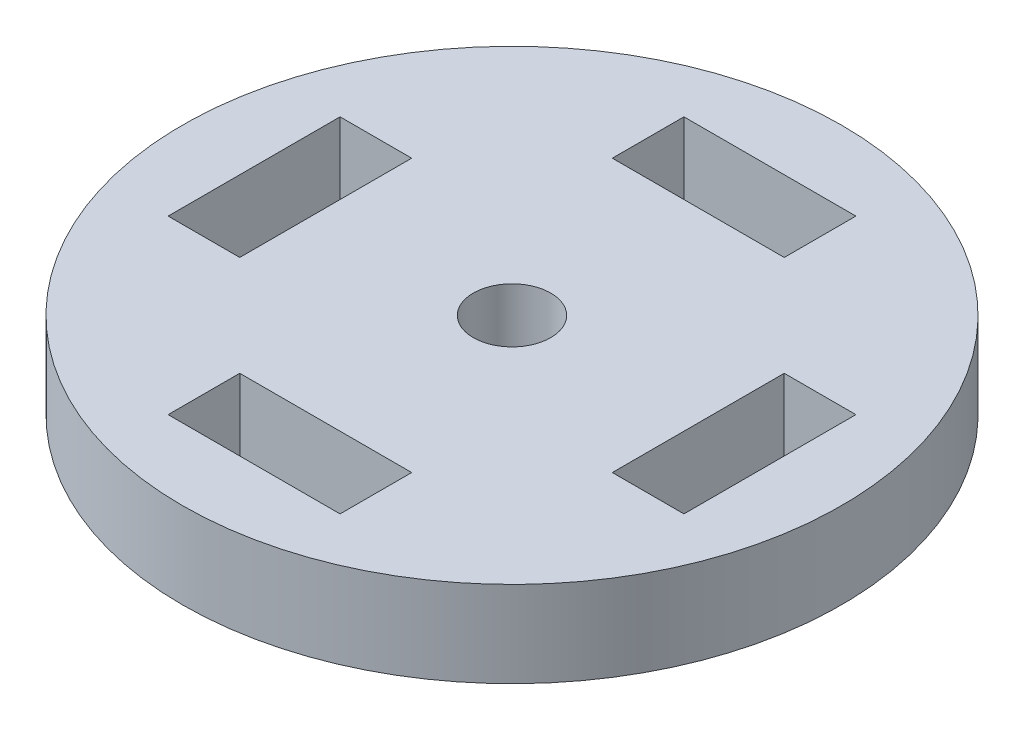
ISO-10303-21;
HEADER;
FILE_DESCRIPTION(('STEP AP214'),'2;1');
FILE_NAME('part.step','',(''),(''),'','','');
FILE_SCHEMA(('AUTOMOTIVE_DESIGN { 1 0 10303 214 1 1 1 1 }'));
ENDSEC;
DATA;
#1=APPLICATION_CONTEXT('core data for automotive mechanical design processes');
#2=APPLICATION_PROTOCOL_DEFINITION('international standard','automotive_design',2000,#1);
#3=PRODUCT_CONTEXT('',#1,'mechanical');
#4=PRODUCT('Part','Part','',(#3));
#5=PRODUCT_RELATED_PRODUCT_CATEGORY('part','',(#4));
#6=PRODUCT_DEFINITION_FORMATION('','',#4);
#7=PRODUCT_DEFINITION_CONTEXT('part definition',#1,'design');
#8=PRODUCT_DEFINITION('design','',#6,#7);
#9=PRODUCT_DEFINITION_SHAPE('','',#8);
#10=(LENGTH_UNIT() NAMED_UNIT(*) SI_UNIT(.MILLI.,.METRE.));
#11=(NAMED_UNIT(*) PLANE_ANGLE_UNIT() SI_UNIT($,.RADIAN.));
#12=(NAMED_UNIT(*) SI_UNIT($,.STERADIAN.) SOLID_ANGLE_UNIT());
#13=UNCERTAINTY_MEASURE_WITH_UNIT(LENGTH_MEASURE(1.E-05),#10,'distance_accuracy_value','');
#14=(GEOMETRIC_REPRESENTATION_CONTEXT(3) GLOBAL_UNCERTAINTY_ASSIGNED_CONTEXT((#13)) GLOBAL_UNIT_ASSIGNED_CONTEXT((#10,
#11,#12)) REPRESENTATION_CONTEXT('',''));
#15=CARTESIAN_POINT('',(0.,0.,0.));
#16=DIRECTION('',(0.,0.,1.));
#17=DIRECTION('',(1.,0.,0.));
#18=AXIS2_PLACEMENT_3D('',#15,#16,#17);
#19=CARTESIAN_POINT('',(0.,3.,0.));
#20=DIRECTION('',(0.,1.,0.));
#21=DIRECTION('',(0.,0.,1.));
#22=AXIS2_PLACEMENT_3D('',#19,#20,#21);
#23=PLANE('',#22);
#24=CARTESIAN_POINT('',(0.,3.,0.));
#25=DIRECTION('',(0.,1.,0.));
#26=DIRECTION('',(0.,0.,1.));
#27=AXIS2_PLACEMENT_3D('',#24,#25,#26);
#28=CIRCLE('',#27,1.35);
#29=CARTESIAN_POINT('',(0.,3.,1.35));
#30=VERTEX_POINT('',#29);
#31=EDGE_CURVE('E342',#30,#30,#28,.T.);
#32=ORIENTED_EDGE('',*,*,#31,.F.);
#33=EDGE_LOOP('',(#32));
#34=FACE_BOUND('',#33,.T.);
#35=CARTESIAN_POINT('',(0.,3.,0.));
#36=DIRECTION('',(0.,1.,0.));
#37=DIRECTION('',(0.,0.,1.));
#38=AXIS2_PLACEMENT_3D('',#35,#36,#37);
#39=CIRCLE('',#38,11.5);
#40=CARTESIAN_POINT('',(0.,3.,11.5));
#41=VERTEX_POINT('',#40);
#42=EDGE_CURVE('E13',#41,#41,#39,.T.);
#43=ORIENTED_EDGE('',*,*,#42,.T.);
#44=EDGE_LOOP('',(#43));
#45=FACE_BOUND('',#44,.T.);
#46=DIRECTION('',(1.,0.,0.));
#47=VECTOR('',#46,1.);
#48=CARTESIAN_POINT('',(-8.99999999999915,3.,3.00000000000172));
#49=LINE('',#48,#47);
#50=CARTESIAN_POINT('',(-8.99999999999915,3.,3.00000000000172));
#51=VERTEX_POINT('',#50);
#52=CARTESIAN_POINT('',(-6.49999999999915,3.,3.00000000000172));
#53=VERTEX_POINT('',#52);
#54=EDGE_CURVE('E318',#51,#53,#49,.T.);
#55=ORIENTED_EDGE('',*,*,#54,.F.);
#56=DIRECTION('',(0.,0.,1.));
#57=VECTOR('',#56,1.);
#58=CARTESIAN_POINT('',(-8.99999999999915,3.,-2.99999999999828));
#59=LINE('',#58,#57);
#60=CARTESIAN_POINT('',(-8.99999999999915,3.,-2.99999999999828));
#61=VERTEX_POINT('',#60);
#62=EDGE_CURVE('E322',#61,#51,#59,.T.);
#63=ORIENTED_EDGE('',*,*,#62,.F.);
#64=DIRECTION('',(-1.,0.,0.));
#65=VECTOR('',#64,1.);
#66=CARTESIAN_POINT('',(-8.99999999999915,3.,-2.99999999999828));
#67=LINE('',#66,#65);
#68=CARTESIAN_POINT('',(-6.49999999999915,3.,-2.99999999999828));
#69=VERTEX_POINT('',#68);
#70=EDGE_CURVE('E299',#69,#61,#67,.T.);
#71=ORIENTED_EDGE('',*,*,#70,.F.);
#72=DIRECTION('',(0.,0.,-1.));
#73=VECTOR('',#72,1.);
#74=CARTESIAN_POINT('',(-6.49999999999915,3.,3.00000000000172));
#75=LINE('',#74,#73);
#76=EDGE_CURVE('E294',#53,#69,#75,.T.);
#77=ORIENTED_EDGE('',*,*,#76,.F.);
#78=EDGE_LOOP('',(#55,#63,#71,#77));
#79=FACE_BOUND('',#78,.T.);
#80=DIRECTION('',(0.,0.,-1.));
#81=VECTOR('',#80,1.);
#82=CARTESIAN_POINT('',(3.00000000000256,3.,9.00000000000087));
#83=LINE('',#82,#81);
#84=CARTESIAN_POINT('',(3.00000000000256,3.,9.00000000000087));
#85=VERTEX_POINT('',#84);
#86=CARTESIAN_POINT('',(3.00000000000256,3.,6.50000000000087));
#87=VERTEX_POINT('',#86);
#88=EDGE_CURVE('E274',#85,#87,#83,.T.);
#89=ORIENTED_EDGE('',*,*,#88,.F.);
#90=DIRECTION('',(1.,0.,0.));
#91=VECTOR('',#90,1.);
#92=CARTESIAN_POINT('',(-2.99999999999744,3.,9.00000000000087));
#93=LINE('',#92,#91);
#94=CARTESIAN_POINT('',(-2.99999999999744,3.,9.00000000000087));
#95=VERTEX_POINT('',#94);
#96=EDGE_CURVE('E278',#95,#85,#93,.T.);
#97=ORIENTED_EDGE('',*,*,#96,.F.);
#98=DIRECTION('',(0.,0.,1.));
#99=VECTOR('',#98,1.);
#100=CARTESIAN_POINT('',(-2.99999999999744,3.,9.00000000000087));
#101=LINE('',#100,#99);
#102=CARTESIAN_POINT('',(-2.99999999999744,3.,6.50000000000087));
#103=VERTEX_POINT('',#102);
#104=EDGE_CURVE('E255',#103,#95,#101,.T.);
#105=ORIENTED_EDGE('',*,*,#104,.F.);
#106=DIRECTION('',(-1.,0.,0.));
#107=VECTOR('',#106,1.);
#108=CARTESIAN_POINT('',(3.00000000000256,3.,6.50000000000087));
#109=LINE('',#108,#107);
#110=EDGE_CURVE('E250',#87,#103,#109,.T.);
#111=ORIENTED_EDGE('',*,*,#110,.F.);
#112=EDGE_LOOP('',(#89,#97,#105,#111));
#113=FACE_BOUND('',#112,.T.);
#114=DIRECTION('',(-1.,0.,0.));
#115=VECTOR('',#114,1.);
#116=CARTESIAN_POINT('',(9.00000000000171,3.,-3.00000000000085));
#117=LINE('',#116,#115);
#118=CARTESIAN_POINT('',(9.00000000000171,3.,-3.00000000000085));
#119=VERTEX_POINT('',#118);
#120=CARTESIAN_POINT('',(6.50000000000171,3.,-3.00000000000084));
#121=VERTEX_POINT('',#120);
#122=EDGE_CURVE('E230',#119,#121,#117,.T.);
#123=ORIENTED_EDGE('',*,*,#122,.F.);
#124=DIRECTION('',(0.,0.,-1.));
#125=VECTOR('',#124,1.);
#126=CARTESIAN_POINT('',(9.00000000000171,3.,2.99999999999915));
#127=LINE('',#126,#125);
#128=CARTESIAN_POINT('',(9.00000000000171,3.,2.99999999999915));
#129=VERTEX_POINT('',#128);
#130=EDGE_CURVE('E234',#129,#119,#127,.T.);
#131=ORIENTED_EDGE('',*,*,#130,.F.);
#132=DIRECTION('',(1.,0.,0.));
#133=VECTOR('',#132,1.);
#134=CARTESIAN_POINT('',(9.00000000000171,3.,2.99999999999915));
#135=LINE('',#134,#133);
#136=CARTESIAN_POINT('',(6.50000000000171,3.,2.99999999999915));
#137=VERTEX_POINT('',#136);
#138=EDGE_CURVE('E211',#137,#129,#135,.T.);
#139=ORIENTED_EDGE('',*,*,#138,.F.);
#140=DIRECTION('',(0.,0.,1.));
#141=VECTOR('',#140,1.);
#142=CARTESIAN_POINT('',(6.50000000000171,3.,-3.00000000000084));
#143=LINE('',#142,#141);
#144=EDGE_CURVE('E76',#121,#137,#143,.T.);
#145=ORIENTED_EDGE('',*,*,#144,.F.);
#146=EDGE_LOOP('',(#123,#131,#139,#145));
#147=FACE_BOUND('',#146,.T.);
#148=DIRECTION('',(-1.,0.,0.));
#149=VECTOR('',#148,1.);
#150=CARTESIAN_POINT('',(3.,3.,-9.));
#151=LINE('',#150,#149);
#152=CARTESIAN_POINT('',(3.,3.,-9.));
#153=VERTEX_POINT('',#152);
#154=CARTESIAN_POINT('',(-3.,3.,-9.));
#155=VERTEX_POINT('',#154);
#156=EDGE_CURVE('E170',#153,#155,#151,.T.);
#157=ORIENTED_EDGE('',*,*,#156,.F.);
#158=DIRECTION('',(0.,0.,-1.));
#159=VECTOR('',#158,1.);
#160=CARTESIAN_POINT('',(3.,3.,-9.));
#161=LINE('',#160,#159);
#162=CARTESIAN_POINT('',(3.,3.,-6.5));
#163=VERTEX_POINT('',#162);
#164=EDGE_CURVE('E179',#163,#153,#161,.T.);
#165=ORIENTED_EDGE('',*,*,#164,.F.);
#166=DIRECTION('',(1.,0.,0.));
#167=VECTOR('',#166,1.);
#168=CARTESIAN_POINT('',(-3.,3.,-6.5));
#169=LINE('',#168,#167);
#170=CARTESIAN_POINT('',(-3.,3.,-6.5));
#171=VERTEX_POINT('',#170);
#172=EDGE_CURVE('E187',#171,#163,#169,.T.);
#173=ORIENTED_EDGE('',*,*,#172,.F.);
#174=DIRECTION('',(0.,0.,1.));
#175=VECTOR('',#174,1.);
#176=CARTESIAN_POINT('',(-3.,3.,-9.));
#177=LINE('',#176,#175);
#178=EDGE_CURVE('E68',#155,#171,#177,.T.);
#179=ORIENTED_EDGE('',*,*,#178,.F.);
#180=EDGE_LOOP('',(#157,#165,#173,#179));
#181=FACE_BOUND('',#180,.T.);
#182=ADVANCED_FACE('F52',(#34,#45,#79,#113,#147,#181),#23,.T.);
#183=CARTESIAN_POINT('',(0.,0.,0.));
#184=DIRECTION('',(0.,1.,0.));
#185=DIRECTION('',(0.,0.,1.));
#186=AXIS2_PLACEMENT_3D('',#183,#184,#185);
#187=PLANE('',#186);
#188=CARTESIAN_POINT('',(0.,0.,0.));
#189=DIRECTION('',(0.,1.,0.));
#190=DIRECTION('',(0.,0.,1.));
#191=AXIS2_PLACEMENT_3D('',#188,#189,#190);
#192=CIRCLE('',#191,1.35);
#193=CARTESIAN_POINT('',(0.,0.,1.35));
#194=VERTEX_POINT('',#193);
#195=EDGE_CURVE('E337',#194,#194,#192,.F.);
#196=ORIENTED_EDGE('',*,*,#195,.F.);
#197=EDGE_LOOP('',(#196));
#198=FACE_BOUND('',#197,.T.);
#199=DIRECTION('',(0.,0.,-1.));
#200=VECTOR('',#199,1.);
#201=CARTESIAN_POINT('',(9.00000000000171,0.,2.99999999999915));
#202=LINE('',#201,#200);
#203=CARTESIAN_POINT('',(9.00000000000171,0.,2.99999999999915));
#204=VERTEX_POINT('',#203);
#205=CARTESIAN_POINT('',(9.00000000000171,0.,-3.00000000000085));
#206=VERTEX_POINT('',#205);
#207=EDGE_CURVE('E223',#204,#206,#202,.T.);
#208=ORIENTED_EDGE('',*,*,#207,.T.);
#209=DIRECTION('',(-1.,0.,0.));
#210=VECTOR('',#209,1.);
#211=CARTESIAN_POINT('',(9.00000000000171,0.,-3.00000000000085));
#212=LINE('',#211,#210);
#213=CARTESIAN_POINT('',(6.50000000000171,0.,-3.00000000000084));
#214=VERTEX_POINT('',#213);
#215=EDGE_CURVE('E218',#206,#214,#212,.T.);
#216=ORIENTED_EDGE('',*,*,#215,.T.);
#217=DIRECTION('',(0.,0.,1.));
#218=VECTOR('',#217,1.);
#219=CARTESIAN_POINT('',(6.50000000000171,0.,-3.00000000000084));
#220=LINE('',#219,#218);
#221=CARTESIAN_POINT('',(6.50000000000171,0.,2.99999999999915));
#222=VERTEX_POINT('',#221);
#223=EDGE_CURVE('E213',#214,#222,#220,.T.);
#224=ORIENTED_EDGE('',*,*,#223,.T.);
#225=DIRECTION('',(1.,0.,0.));
#226=VECTOR('',#225,1.);
#227=CARTESIAN_POINT('',(9.00000000000171,0.,2.99999999999915));
#228=LINE('',#227,#226);
#229=EDGE_CURVE('E207',#222,#204,#228,.T.);
#230=ORIENTED_EDGE('',*,*,#229,.T.);
#231=EDGE_LOOP('',(#208,#216,#224,#230));
#232=FACE_BOUND('',#231,.T.);
#233=DIRECTION('',(0.,0.,1.));
#234=VECTOR('',#233,1.);
#235=CARTESIAN_POINT('',(-8.99999999999915,0.,-2.99999999999828));
#236=LINE('',#235,#234);
#237=CARTESIAN_POINT('',(-8.99999999999915,0.,-2.99999999999828));
#238=VERTEX_POINT('',#237);
#239=CARTESIAN_POINT('',(-8.99999999999915,0.,3.00000000000172));
#240=VERTEX_POINT('',#239);
#241=EDGE_CURVE('E311',#238,#240,#236,.T.);
#242=ORIENTED_EDGE('',*,*,#241,.T.);
#243=DIRECTION('',(1.,0.,0.));
#244=VECTOR('',#243,1.);
#245=CARTESIAN_POINT('',(-8.99999999999915,0.,3.00000000000172));
#246=LINE('',#245,#244);
#247=CARTESIAN_POINT('',(-6.49999999999915,0.,3.00000000000172));
#248=VERTEX_POINT('',#247);
#249=EDGE_CURVE('E306',#240,#248,#246,.T.);
#250=ORIENTED_EDGE('',*,*,#249,.T.);
#251=DIRECTION('',(0.,0.,-1.));
#252=VECTOR('',#251,1.);
#253=CARTESIAN_POINT('',(-6.49999999999915,0.,3.00000000000172));
#254=LINE('',#253,#252);
#255=CARTESIAN_POINT('',(-6.49999999999915,0.,-2.99999999999828));
#256=VERTEX_POINT('',#255);
#257=EDGE_CURVE('E301',#248,#256,#254,.T.);
#258=ORIENTED_EDGE('',*,*,#257,.T.);
#259=DIRECTION('',(-1.,0.,0.));
#260=VECTOR('',#259,1.);
#261=CARTESIAN_POINT('',(-8.99999999999915,0.,-2.99999999999828));
#262=LINE('',#261,#260);
#263=EDGE_CURVE('E295',#256,#238,#262,.T.);
#264=ORIENTED_EDGE('',*,*,#263,.T.);
#265=EDGE_LOOP('',(#242,#250,#258,#264));
#266=FACE_BOUND('',#265,.T.);
#267=CARTESIAN_POINT('',(0.,0.,0.));
#268=DIRECTION('',(0.,1.,0.));
#269=DIRECTION('',(0.,0.,1.));
#270=AXIS2_PLACEMENT_3D('',#267,#268,#269);
#271=CIRCLE('',#270,11.5);
#272=CARTESIAN_POINT('',(0.,0.,11.5));
#273=VERTEX_POINT('',#272);
#274=EDGE_CURVE('E56',#273,#273,#271,.T.);
#275=ORIENTED_EDGE('',*,*,#274,.F.);
#276=EDGE_LOOP('',(#275));
#277=FACE_BOUND('',#276,.T.);
#278=DIRECTION('',(1.,0.,0.));
#279=VECTOR('',#278,1.);
#280=CARTESIAN_POINT('',(-2.99999999999744,0.,9.00000000000087));
#281=LINE('',#280,#279);
#282=CARTESIAN_POINT('',(-2.99999999999744,0.,9.00000000000087));
#283=VERTEX_POINT('',#282);
#284=CARTESIAN_POINT('',(3.00000000000256,0.,9.00000000000087));
#285=VERTEX_POINT('',#284);
#286=EDGE_CURVE('E267',#283,#285,#281,.T.);
#287=ORIENTED_EDGE('',*,*,#286,.T.);
#288=DIRECTION('',(0.,0.,-1.));
#289=VECTOR('',#288,1.);
#290=CARTESIAN_POINT('',(3.00000000000256,0.,9.00000000000087));
#291=LINE('',#290,#289);
#292=CARTESIAN_POINT('',(3.00000000000256,0.,6.50000000000087));
#293=VERTEX_POINT('',#292);
#294=EDGE_CURVE('E262',#285,#293,#291,.T.);
#295=ORIENTED_EDGE('',*,*,#294,.T.);
#296=DIRECTION('',(-1.,0.,0.));
#297=VECTOR('',#296,1.);
#298=CARTESIAN_POINT('',(3.00000000000256,0.,6.50000000000087));
#299=LINE('',#298,#297);
#300=CARTESIAN_POINT('',(-2.99999999999744,0.,6.50000000000087));
#301=VERTEX_POINT('',#300);
#302=EDGE_CURVE('E257',#293,#301,#299,.T.);
#303=ORIENTED_EDGE('',*,*,#302,.T.);
#304=DIRECTION('',(0.,0.,1.));
#305=VECTOR('',#304,1.);
#306=CARTESIAN_POINT('',(-2.99999999999744,0.,9.00000000000087));
#307=LINE('',#306,#305);
#308=EDGE_CURVE('E251',#301,#283,#307,.T.);
#309=ORIENTED_EDGE('',*,*,#308,.T.);
#310=EDGE_LOOP('',(#287,#295,#303,#309));
#311=FACE_BOUND('',#310,.T.);
#312=DIRECTION('',(0.,0.,-1.));
#313=VECTOR('',#312,1.);
#314=CARTESIAN_POINT('',(3.,0.,-9.));
#315=LINE('',#314,#313);
#316=CARTESIAN_POINT('',(3.,0.,-6.5));
#317=VERTEX_POINT('',#316);
#318=CARTESIAN_POINT('',(3.,0.,-9.));
#319=VERTEX_POINT('',#318);
#320=EDGE_CURVE('E176',#317,#319,#315,.T.);
#321=ORIENTED_EDGE('',*,*,#320,.T.);
#322=DIRECTION('',(-1.,0.,0.));
#323=VECTOR('',#322,1.);
#324=CARTESIAN_POINT('',(3.,0.,-9.));
#325=LINE('',#324,#323);
#326=CARTESIAN_POINT('',(-3.,0.,-9.));
#327=VERTEX_POINT('',#326);
#328=EDGE_CURVE('E172',#319,#327,#325,.T.);
#329=ORIENTED_EDGE('',*,*,#328,.T.);
#330=DIRECTION('',(0.,0.,1.));
#331=VECTOR('',#330,1.);
#332=CARTESIAN_POINT('',(-3.,0.,-9.));
#333=LINE('',#332,#331);
#334=CARTESIAN_POINT('',(-3.,0.,-6.5));
#335=VERTEX_POINT('',#334);
#336=EDGE_CURVE('E201',#327,#335,#333,.T.);
#337=ORIENTED_EDGE('',*,*,#336,.T.);
#338=DIRECTION('',(1.,0.,0.));
#339=VECTOR('',#338,1.);
#340=CARTESIAN_POINT('',(-3.,0.,-6.5));
#341=LINE('',#340,#339);
#342=EDGE_CURVE('E196',#335,#317,#341,.T.);
#343=ORIENTED_EDGE('',*,*,#342,.T.);
#344=EDGE_LOOP('',(#321,#329,#337,#343));
#345=FACE_BOUND('',#344,.T.);
#346=ADVANCED_FACE('F359',(#198,#232,#266,#277,#311,#345),#187,.F.);
#347=CARTESIAN_POINT('',(0.,3.,0.));
#348=DIRECTION('',(0.,-1.,0.));
#349=DIRECTION('',(0.,0.,-1.));
#350=AXIS2_PLACEMENT_3D('',#347,#348,#349);
#351=CYLINDRICAL_SURFACE('',#350,11.5);
#352=ORIENTED_EDGE('',*,*,#42,.F.);
#353=EDGE_LOOP('',(#352));
#354=FACE_BOUND('',#353,.T.);
#355=ORIENTED_EDGE('',*,*,#274,.T.);
#356=EDGE_LOOP('',(#355));
#357=FACE_BOUND('',#356,.T.);
#358=ADVANCED_FACE('F54',(#354,#357),#351,.T.);
#359=CARTESIAN_POINT('',(-8.99999999999915,9.5,-2.99999999999828));
#360=DIRECTION('',(1.,0.,0.));
#361=DIRECTION('',(0.,0.,-1.));
#362=AXIS2_PLACEMENT_3D('',#359,#360,#361);
#363=PLANE('',#362);
#364=ORIENTED_EDGE('',*,*,#62,.T.);
#365=DIRECTION('',(0.,-1.,0.));
#366=VECTOR('',#365,1.);
#367=CARTESIAN_POINT('',(-8.99999999999915,9.5,3.00000000000172));
#368=LINE('',#367,#366);
#369=EDGE_CURVE('E310',#51,#240,#368,.T.);
#370=ORIENTED_EDGE('',*,*,#369,.T.);
#371=ORIENTED_EDGE('',*,*,#241,.F.);
#372=DIRECTION('',(0.,-1.,0.));
#373=VECTOR('',#372,1.);
#374=CARTESIAN_POINT('',(-8.99999999999915,9.5,-2.99999999999828));
#375=LINE('',#374,#373);
#376=EDGE_CURVE('E315',#61,#238,#375,.T.);
#377=ORIENTED_EDGE('',*,*,#376,.F.);
#378=EDGE_LOOP('',(#364,#370,#371,#377));
#379=FACE_BOUND('',#378,.T.);
#380=ADVANCED_FACE('F384',(#379),#363,.T.);
#381=CARTESIAN_POINT('',(-8.99999999999915,9.5,3.00000000000172));
#382=DIRECTION('',(0.,0.,-1.));
#383=DIRECTION('',(-1.,0.,0.));
#384=AXIS2_PLACEMENT_3D('',#381,#382,#383);
#385=PLANE('',#384);
#386=ORIENTED_EDGE('',*,*,#54,.T.);
#387=DIRECTION('',(0.,-1.,0.));
#388=VECTOR('',#387,1.);
#389=CARTESIAN_POINT('',(-6.49999999999915,9.5,3.00000000000172));
#390=LINE('',#389,#388);
#391=EDGE_CURVE('E305',#53,#248,#390,.T.);
#392=ORIENTED_EDGE('',*,*,#391,.T.);
#393=ORIENTED_EDGE('',*,*,#249,.F.);
#394=ORIENTED_EDGE('',*,*,#369,.F.);
#395=EDGE_LOOP('',(#386,#392,#393,#394));
#396=FACE_BOUND('',#395,.T.);
#397=ADVANCED_FACE('F387',(#396),#385,.T.);
#398=CARTESIAN_POINT('',(-6.49999999999915,9.5,3.00000000000172));
#399=DIRECTION('',(-1.,0.,0.));
#400=DIRECTION('',(0.,0.,1.));
#401=AXIS2_PLACEMENT_3D('',#398,#399,#400);
#402=PLANE('',#401);
#403=ORIENTED_EDGE('',*,*,#76,.T.);
#404=DIRECTION('',(0.,-1.,0.));
#405=VECTOR('',#404,1.);
#406=CARTESIAN_POINT('',(-6.49999999999915,9.5,-2.99999999999828));
#407=LINE('',#406,#405);
#408=EDGE_CURVE('E300',#69,#256,#407,.T.);
#409=ORIENTED_EDGE('',*,*,#408,.T.);
#410=ORIENTED_EDGE('',*,*,#257,.F.);
#411=ORIENTED_EDGE('',*,*,#391,.F.);
#412=EDGE_LOOP('',(#403,#409,#410,#411));
#413=FACE_BOUND('',#412,.T.);
#414=ADVANCED_FACE('F391',(#413),#402,.T.);
#415=CARTESIAN_POINT('',(-8.99999999999915,9.5,-2.99999999999828));
#416=DIRECTION('',(0.,0.,1.));
#417=DIRECTION('',(1.,0.,0.));
#418=AXIS2_PLACEMENT_3D('',#415,#416,#417);
#419=PLANE('',#418);
#420=ORIENTED_EDGE('',*,*,#70,.T.);
#421=ORIENTED_EDGE('',*,*,#376,.T.);
#422=ORIENTED_EDGE('',*,*,#263,.F.);
#423=ORIENTED_EDGE('',*,*,#408,.F.);
#424=EDGE_LOOP('',(#420,#421,#422,#423));
#425=FACE_BOUND('',#424,.T.);
#426=ADVANCED_FACE('F395',(#425),#419,.T.);
#427=CARTESIAN_POINT('',(-2.99999999999744,9.5,9.00000000000087));
#428=DIRECTION('',(0.,0.,-1.));
#429=DIRECTION('',(-1.,0.,0.));
#430=AXIS2_PLACEMENT_3D('',#427,#428,#429);
#431=PLANE('',#430);
#432=ORIENTED_EDGE('',*,*,#96,.T.);
#433=DIRECTION('',(0.,-1.,0.));
#434=VECTOR('',#433,1.);
#435=CARTESIAN_POINT('',(3.00000000000256,9.5,9.00000000000087));
#436=LINE('',#435,#434);
#437=EDGE_CURVE('E266',#85,#285,#436,.T.);
#438=ORIENTED_EDGE('',*,*,#437,.T.);
#439=ORIENTED_EDGE('',*,*,#286,.F.);
#440=DIRECTION('',(0.,-1.,0.));
#441=VECTOR('',#440,1.);
#442=CARTESIAN_POINT('',(-2.99999999999744,9.5,9.00000000000087));
#443=LINE('',#442,#441);
#444=EDGE_CURVE('E271',#95,#283,#443,.T.);
#445=ORIENTED_EDGE('',*,*,#444,.F.);
#446=EDGE_LOOP('',(#432,#438,#439,#445));
#447=FACE_BOUND('',#446,.T.);
#448=ADVANCED_FACE('F399',(#447),#431,.T.);
#449=CARTESIAN_POINT('',(3.00000000000256,9.5,9.00000000000087));
#450=DIRECTION('',(-1.,0.,0.));
#451=DIRECTION('',(0.,0.,1.));
#452=AXIS2_PLACEMENT_3D('',#449,#450,#451);
#453=PLANE('',#452);
#454=ORIENTED_EDGE('',*,*,#88,.T.);
#455=DIRECTION('',(0.,-1.,0.));
#456=VECTOR('',#455,1.);
#457=CARTESIAN_POINT('',(3.00000000000256,9.5,6.50000000000087));
#458=LINE('',#457,#456);
#459=EDGE_CURVE('E261',#87,#293,#458,.T.);
#460=ORIENTED_EDGE('',*,*,#459,.T.);
#461=ORIENTED_EDGE('',*,*,#294,.F.);
#462=ORIENTED_EDGE('',*,*,#437,.F.);
#463=EDGE_LOOP('',(#454,#460,#461,#462));
#464=FACE_BOUND('',#463,.T.);
#465=ADVANCED_FACE('F402',(#464),#453,.T.);
#466=CARTESIAN_POINT('',(3.00000000000256,9.5,6.50000000000087));
#467=DIRECTION('',(0.,0.,1.));
#468=DIRECTION('',(1.,0.,0.));
#469=AXIS2_PLACEMENT_3D('',#466,#467,#468);
#470=PLANE('',#469);
#471=ORIENTED_EDGE('',*,*,#110,.T.);
#472=DIRECTION('',(0.,-1.,0.));
#473=VECTOR('',#472,1.);
#474=CARTESIAN_POINT('',(-2.99999999999744,9.5,6.50000000000087));
#475=LINE('',#474,#473);
#476=EDGE_CURVE('E256',#103,#301,#475,.T.);
#477=ORIENTED_EDGE('',*,*,#476,.T.);
#478=ORIENTED_EDGE('',*,*,#302,.F.);
#479=ORIENTED_EDGE('',*,*,#459,.F.);
#480=EDGE_LOOP('',(#471,#477,#478,#479));
#481=FACE_BOUND('',#480,.T.);
#482=ADVANCED_FACE('F406',(#481),#470,.T.);
#483=CARTESIAN_POINT('',(-2.99999999999744,9.5,9.00000000000087));
#484=DIRECTION('',(1.,0.,0.));
#485=DIRECTION('',(0.,0.,-1.));
#486=AXIS2_PLACEMENT_3D('',#483,#484,#485);
#487=PLANE('',#486);
#488=ORIENTED_EDGE('',*,*,#104,.T.);
#489=ORIENTED_EDGE('',*,*,#444,.T.);
#490=ORIENTED_EDGE('',*,*,#308,.F.);
#491=ORIENTED_EDGE('',*,*,#476,.F.);
#492=EDGE_LOOP('',(#488,#489,#490,#491));
#493=FACE_BOUND('',#492,.T.);
#494=ADVANCED_FACE('F410',(#493),#487,.T.);
#495=CARTESIAN_POINT('',(9.00000000000171,9.5,2.99999999999915));
#496=DIRECTION('',(-1.,0.,0.));
#497=DIRECTION('',(0.,0.,1.));
#498=AXIS2_PLACEMENT_3D('',#495,#496,#497);
#499=PLANE('',#498);
#500=ORIENTED_EDGE('',*,*,#130,.T.);
#501=DIRECTION('',(0.,-1.,0.));
#502=VECTOR('',#501,1.);
#503=CARTESIAN_POINT('',(9.00000000000171,9.5,-3.00000000000085));
#504=LINE('',#503,#502);
#505=EDGE_CURVE('E222',#119,#206,#504,.T.);
#506=ORIENTED_EDGE('',*,*,#505,.T.);
#507=ORIENTED_EDGE('',*,*,#207,.F.);
#508=DIRECTION('',(0.,-1.,0.));
#509=VECTOR('',#508,1.);
#510=CARTESIAN_POINT('',(9.00000000000171,9.5,2.99999999999915));
#511=LINE('',#510,#509);
#512=EDGE_CURVE('E227',#129,#204,#511,.T.);
#513=ORIENTED_EDGE('',*,*,#512,.F.);
#514=EDGE_LOOP('',(#500,#506,#507,#513));
#515=FACE_BOUND('',#514,.T.);
#516=ADVANCED_FACE('F414',(#515),#499,.T.);
#517=CARTESIAN_POINT('',(9.00000000000171,9.5,-3.00000000000085));
#518=DIRECTION('',(0.,0.,1.));
#519=DIRECTION('',(1.,0.,0.));
#520=AXIS2_PLACEMENT_3D('',#517,#518,#519);
#521=PLANE('',#520);
#522=ORIENTED_EDGE('',*,*,#122,.T.);
#523=DIRECTION('',(0.,-1.,0.));
#524=VECTOR('',#523,1.);
#525=CARTESIAN_POINT('',(6.50000000000171,9.5,-3.00000000000084));
#526=LINE('',#525,#524);
#527=EDGE_CURVE('E217',#121,#214,#526,.T.);
#528=ORIENTED_EDGE('',*,*,#527,.T.);
#529=ORIENTED_EDGE('',*,*,#215,.F.);
#530=ORIENTED_EDGE('',*,*,#505,.F.);
#531=EDGE_LOOP('',(#522,#528,#529,#530));
#532=FACE_BOUND('',#531,.T.);
#533=ADVANCED_FACE('F418',(#532),#521,.T.);
#534=CARTESIAN_POINT('',(6.50000000000171,9.5,-3.00000000000084));
#535=DIRECTION('',(1.,0.,0.));
#536=DIRECTION('',(0.,0.,-1.));
#537=AXIS2_PLACEMENT_3D('',#534,#535,#536);
#538=PLANE('',#537);
#539=ORIENTED_EDGE('',*,*,#144,.T.);
#540=DIRECTION('',(0.,-1.,0.));
#541=VECTOR('',#540,1.);
#542=CARTESIAN_POINT('',(6.50000000000171,9.5,2.99999999999915));
#543=LINE('',#542,#541);
#544=EDGE_CURVE('E212',#137,#222,#543,.T.);
#545=ORIENTED_EDGE('',*,*,#544,.T.);
#546=ORIENTED_EDGE('',*,*,#223,.F.);
#547=ORIENTED_EDGE('',*,*,#527,.F.);
#548=EDGE_LOOP('',(#539,#545,#546,#547));
#549=FACE_BOUND('',#548,.T.);
#550=ADVANCED_FACE('F422',(#549),#538,.T.);
#551=CARTESIAN_POINT('',(9.00000000000171,9.5,2.99999999999915));
#552=DIRECTION('',(0.,0.,-1.));
#553=DIRECTION('',(-1.,0.,0.));
#554=AXIS2_PLACEMENT_3D('',#551,#552,#553);
#555=PLANE('',#554);
#556=ORIENTED_EDGE('',*,*,#138,.T.);
#557=ORIENTED_EDGE('',*,*,#512,.T.);
#558=ORIENTED_EDGE('',*,*,#229,.F.);
#559=ORIENTED_EDGE('',*,*,#544,.F.);
#560=EDGE_LOOP('',(#556,#557,#558,#559));
#561=FACE_BOUND('',#560,.T.);
#562=ADVANCED_FACE('F426',(#561),#555,.T.);
#563=CARTESIAN_POINT('',(3.,9.5,-9.));
#564=DIRECTION('',(-1.,0.,0.));
#565=DIRECTION('',(0.,0.,1.));
#566=AXIS2_PLACEMENT_3D('',#563,#564,#565);
#567=PLANE('',#566);
#568=ORIENTED_EDGE('',*,*,#164,.T.);
#569=DIRECTION('',(0.,-1.,0.));
#570=VECTOR('',#569,1.);
#571=CARTESIAN_POINT('',(3.,9.5,-9.));
#572=LINE('',#571,#570);
#573=EDGE_CURVE('E166',#153,#319,#572,.T.);
#574=ORIENTED_EDGE('',*,*,#573,.T.);
#575=ORIENTED_EDGE('',*,*,#320,.F.);
#576=DIRECTION('',(0.,-1.,0.));
#577=VECTOR('',#576,1.);
#578=CARTESIAN_POINT('',(3.,9.5,-6.5));
#579=LINE('',#578,#577);
#580=EDGE_CURVE('E182',#163,#317,#579,.T.);
#581=ORIENTED_EDGE('',*,*,#580,.F.);
#582=EDGE_LOOP('',(#568,#574,#575,#581));
#583=FACE_BOUND('',#582,.T.);
#584=ADVANCED_FACE('F180',(#583),#567,.T.);
#585=CARTESIAN_POINT('',(3.,9.5,-9.));
#586=DIRECTION('',(0.,0.,1.));
#587=DIRECTION('',(1.,0.,0.));
#588=AXIS2_PLACEMENT_3D('',#585,#586,#587);
#589=PLANE('',#588);
#590=ORIENTED_EDGE('',*,*,#156,.T.);
#591=DIRECTION('',(0.,-1.,0.));
#592=VECTOR('',#591,1.);
#593=CARTESIAN_POINT('',(-3.,9.5,-9.));
#594=LINE('',#593,#592);
#595=EDGE_CURVE('E198',#155,#327,#594,.T.);
#596=ORIENTED_EDGE('',*,*,#595,.T.);
#597=ORIENTED_EDGE('',*,*,#328,.F.);
#598=ORIENTED_EDGE('',*,*,#573,.F.);
#599=EDGE_LOOP('',(#590,#596,#597,#598));
#600=FACE_BOUND('',#599,.T.);
#601=ADVANCED_FACE('F168',(#600),#589,.T.);
#602=CARTESIAN_POINT('',(-3.,9.5,-9.));
#603=DIRECTION('',(1.,0.,0.));
#604=DIRECTION('',(0.,0.,-1.));
#605=AXIS2_PLACEMENT_3D('',#602,#603,#604);
#606=PLANE('',#605);
#607=ORIENTED_EDGE('',*,*,#178,.T.);
#608=DIRECTION('',(0.,-1.,0.));
#609=VECTOR('',#608,1.);
#610=CARTESIAN_POINT('',(-3.,9.5,-6.5));
#611=LINE('',#610,#609);
#612=EDGE_CURVE('E202',#171,#335,#611,.T.);
#613=ORIENTED_EDGE('',*,*,#612,.T.);
#614=ORIENTED_EDGE('',*,*,#336,.F.);
#615=ORIENTED_EDGE('',*,*,#595,.F.);
#616=EDGE_LOOP('',(#607,#613,#614,#615));
#617=FACE_BOUND('',#616,.T.);
#618=ADVANCED_FACE('F364',(#617),#606,.T.);
#619=CARTESIAN_POINT('',(-3.,9.5,-6.5));
#620=DIRECTION('',(0.,0.,-1.));
#621=DIRECTION('',(-1.,0.,0.));
#622=AXIS2_PLACEMENT_3D('',#619,#620,#621);
#623=PLANE('',#622);
#624=ORIENTED_EDGE('',*,*,#172,.T.);
#625=ORIENTED_EDGE('',*,*,#580,.T.);
#626=ORIENTED_EDGE('',*,*,#342,.F.);
#627=ORIENTED_EDGE('',*,*,#612,.F.);
#628=EDGE_LOOP('',(#624,#625,#626,#627));
#629=FACE_BOUND('',#628,.T.);
#630=ADVANCED_FACE('F362',(#629),#623,.T.);
#631=CARTESIAN_POINT('',(0.,-3.81837661840736,0.));
#632=DIRECTION('',(0.,1.,0.));
#633=DIRECTION('',(0.,0.,1.));
#634=AXIS2_PLACEMENT_3D('',#631,#632,#633);
#635=CYLINDRICAL_SURFACE('',#634,1.35);
#636=ORIENTED_EDGE('',*,*,#195,.T.);
#637=EDGE_LOOP('',(#636));
#638=FACE_BOUND('',#637,.T.);
#639=ORIENTED_EDGE('',*,*,#31,.T.);
#640=EDGE_LOOP('',(#639));
#641=FACE_BOUND('',#640,.T.);
#642=ADVANCED_FACE('F371',(#638,#641),#635,.F.);
#643=CLOSED_SHELL('',(#182,#346,#358,#380,#397,#414,#426,#448,#465,#482,#494,#516,#533,#550,
#562,#584,#601,#618,#630,#642));
#644=MANIFOLD_SOLID_BREP('B2',#643);
#645=ADVANCED_BREP_SHAPE_REPRESENTATION('',(#18,#644),#14);
#646=SHAPE_DEFINITION_REPRESENTATION(#9,#645);
ENDSEC;
END-ISO-10303-21;
